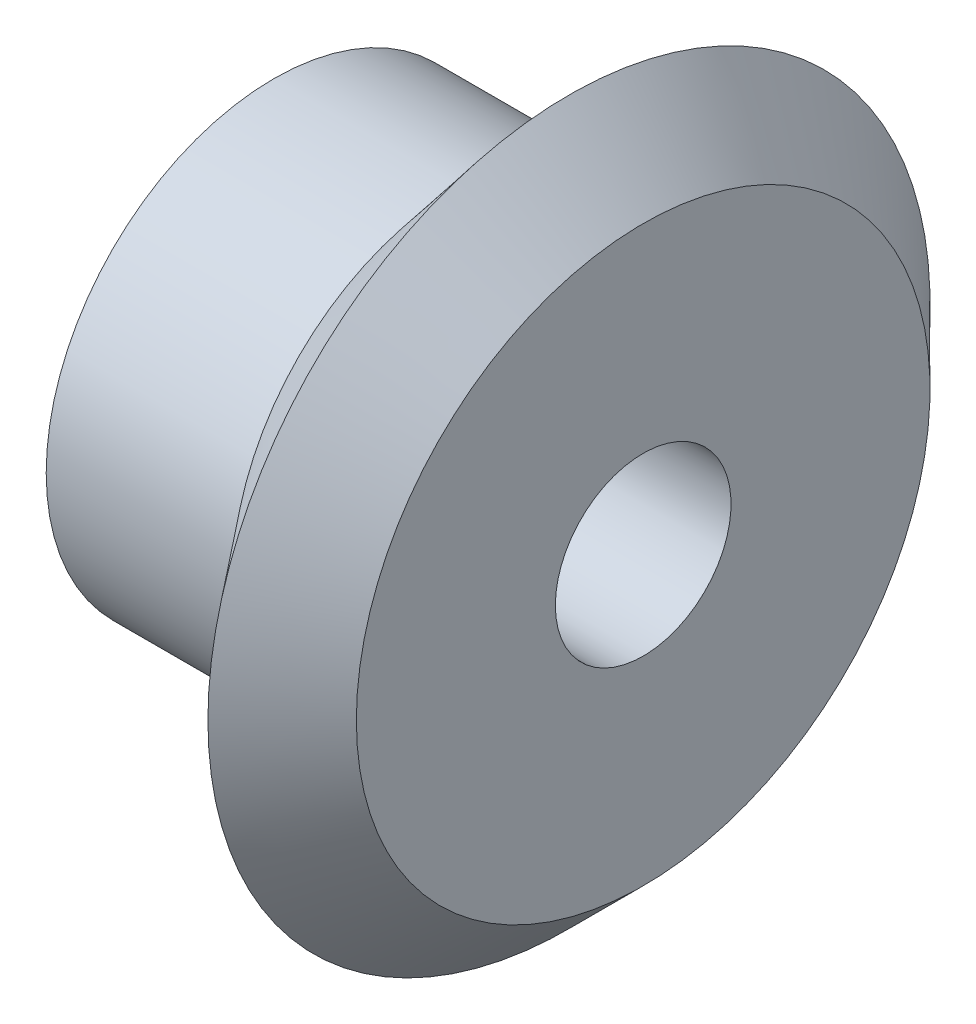
ISO-10303-21;
HEADER;
FILE_DESCRIPTION(('STEP AP214'),'2;1');
FILE_NAME('part.step','',(''),(''),'','','');
FILE_SCHEMA(('AUTOMOTIVE_DESIGN { 1 0 10303 214 1 1 1 1 }'));
ENDSEC;
DATA;
#1=APPLICATION_CONTEXT('core data for automotive mechanical design processes');
#2=APPLICATION_PROTOCOL_DEFINITION('international standard','automotive_design',2000,#1);
#3=PRODUCT_CONTEXT('',#1,'mechanical');
#4=PRODUCT('Part','Part','',(#3));
#5=PRODUCT_RELATED_PRODUCT_CATEGORY('part','',(#4));
#6=PRODUCT_DEFINITION_FORMATION('','',#4);
#7=PRODUCT_DEFINITION_CONTEXT('part definition',#1,'design');
#8=PRODUCT_DEFINITION('design','',#6,#7);
#9=PRODUCT_DEFINITION_SHAPE('','',#8);
#10=(LENGTH_UNIT() NAMED_UNIT(*) SI_UNIT(.MILLI.,.METRE.));
#11=(NAMED_UNIT(*) PLANE_ANGLE_UNIT() SI_UNIT($,.RADIAN.));
#12=(NAMED_UNIT(*) SI_UNIT($,.STERADIAN.) SOLID_ANGLE_UNIT());
#13=UNCERTAINTY_MEASURE_WITH_UNIT(LENGTH_MEASURE(1.E-05),#10,'distance_accuracy_value','');
#14=(GEOMETRIC_REPRESENTATION_CONTEXT(3) GLOBAL_UNCERTAINTY_ASSIGNED_CONTEXT((#13)) GLOBAL_UNIT_ASSIGNED_CONTEXT((#10,
#11,#12)) REPRESENTATION_CONTEXT('',''));
#15=CARTESIAN_POINT('',(0.,0.,0.));
#16=DIRECTION('',(0.,0.,1.));
#17=DIRECTION('',(1.,0.,0.));
#18=AXIS2_PLACEMENT_3D('',#15,#16,#17);
#19=CARTESIAN_POINT('',(4.84326150610929,2.45,0.));
#20=DIRECTION('',(-1.,0.,0.));
#21=DIRECTION('',(0.,0.,1.));
#22=AXIS2_PLACEMENT_3D('',#19,#20,#21);
#23=PLANE('',#22);
#24=CARTESIAN_POINT('',(4.84326150610929,0.,0.));
#25=DIRECTION('',(-1.,0.,0.));
#26=DIRECTION('',(0.,0.,1.));
#27=AXIS2_PLACEMENT_3D('',#24,#25,#26);
#28=CIRCLE('',#27,8.);
#29=CARTESIAN_POINT('',(4.84326150610929,0.,8.));
#30=VERTEX_POINT('',#29);
#31=EDGE_CURVE('E53',#30,#30,#28,.T.);
#32=ORIENTED_EDGE('',*,*,#31,.F.);
#33=EDGE_LOOP('',(#32));
#34=FACE_BOUND('',#33,.T.);
#35=CARTESIAN_POINT('',(4.84326150610929,0.,0.));
#36=DIRECTION('',(-1.,0.,0.));
#37=DIRECTION('',(0.,0.,1.));
#38=AXIS2_PLACEMENT_3D('',#35,#36,#37);
#39=CIRCLE('',#38,2.45);
#40=CARTESIAN_POINT('',(4.84326150610929,0.,2.45));
#41=VERTEX_POINT('',#40);
#42=EDGE_CURVE('E10',#41,#41,#39,.T.);
#43=ORIENTED_EDGE('',*,*,#42,.T.);
#44=EDGE_LOOP('',(#43));
#45=FACE_BOUND('',#44,.T.);
#46=ADVANCED_FACE('F31',(#34,#45),#23,.F.);
#47=CARTESIAN_POINT('',(-22.2616484326181,0.,0.));
#48=DIRECTION('',(-1.,0.,0.));
#49=DIRECTION('',(0.,0.,1.));
#50=AXIS2_PLACEMENT_3D('',#47,#48,#49);
#51=CYLINDRICAL_SURFACE('',#50,2.45);
#52=ORIENTED_EDGE('',*,*,#42,.F.);
#53=EDGE_LOOP('',(#52));
#54=FACE_BOUND('',#53,.T.);
#55=CARTESIAN_POINT('',(-5.45673849389071,0.,0.));
#56=DIRECTION('',(-1.,0.,0.));
#57=DIRECTION('',(0.,0.,1.));
#58=AXIS2_PLACEMENT_3D('',#55,#56,#57);
#59=CIRCLE('',#58,2.45);
#60=CARTESIAN_POINT('',(-5.45673849389071,0.,2.45));
#61=VERTEX_POINT('',#60);
#62=EDGE_CURVE('E37',#61,#61,#59,.T.);
#63=ORIENTED_EDGE('',*,*,#62,.T.);
#64=EDGE_LOOP('',(#63));
#65=FACE_BOUND('',#64,.T.);
#66=ADVANCED_FACE('F60',(#54,#65),#51,.F.);
#67=CARTESIAN_POINT('',(-5.45673849389071,2.45,0.));
#68=DIRECTION('',(1.,0.,0.));
#69=DIRECTION('',(0.,0.,-1.));
#70=AXIS2_PLACEMENT_3D('',#67,#68,#69);
#71=PLANE('',#70);
#72=ORIENTED_EDGE('',*,*,#62,.F.);
#73=EDGE_LOOP('',(#72));
#74=FACE_BOUND('',#73,.T.);
#75=CARTESIAN_POINT('',(-5.45673849389071,0.,0.));
#76=DIRECTION('',(-1.,0.,0.));
#77=DIRECTION('',(0.,0.,1.));
#78=AXIS2_PLACEMENT_3D('',#75,#76,#77);
#79=CIRCLE('',#78,6.35);
#80=CARTESIAN_POINT('',(-5.45673849389071,0.,6.35));
#81=VERTEX_POINT('',#80);
#82=EDGE_CURVE('E41',#81,#81,#79,.T.);
#83=ORIENTED_EDGE('',*,*,#82,.T.);
#84=EDGE_LOOP('',(#83));
#85=FACE_BOUND('',#84,.T.);
#86=ADVANCED_FACE('F64',(#74,#85),#71,.F.);
#87=CARTESIAN_POINT('',(-22.2616484326181,0.,0.));
#88=DIRECTION('',(-1.,0.,0.));
#89=DIRECTION('',(0.,0.,1.));
#90=AXIS2_PLACEMENT_3D('',#87,#88,#89);
#91=CYLINDRICAL_SURFACE('',#90,6.35);
#92=ORIENTED_EDGE('',*,*,#82,.F.);
#93=EDGE_LOOP('',(#92));
#94=FACE_BOUND('',#93,.T.);
#95=CARTESIAN_POINT('',(-0.266738493890709,0.,0.));
#96=DIRECTION('',(-1.,0.,0.));
#97=DIRECTION('',(0.,0.,1.));
#98=AXIS2_PLACEMENT_3D('',#95,#96,#97);
#99=CIRCLE('',#98,6.35);
#100=CARTESIAN_POINT('',(-0.266738493890709,0.,6.35));
#101=VERTEX_POINT('',#100);
#102=EDGE_CURVE('E45',#101,#101,#99,.T.);
#103=ORIENTED_EDGE('',*,*,#102,.T.);
#104=EDGE_LOOP('',(#103));
#105=FACE_BOUND('',#104,.T.);
#106=ADVANCED_FACE('F69',(#94,#105),#91,.T.);
#107=CARTESIAN_POINT('',(2.77326150610929,0.,0.));
#108=DIRECTION('',(1.,0.,0.));
#109=DIRECTION('',(0.,0.,-1.));
#110=AXIS2_PLACEMENT_3D('',#107,#108,#109);
#111=CONICAL_SURFACE('',#110,10.07,0.885652638903025);
#112=ORIENTED_EDGE('',*,*,#102,.F.);
#113=EDGE_LOOP('',(#112));
#114=FACE_BOUND('',#113,.T.);
#115=CARTESIAN_POINT('',(2.77326150610929,0.,0.));
#116=DIRECTION('',(-1.,0.,0.));
#117=DIRECTION('',(0.,0.,1.));
#118=AXIS2_PLACEMENT_3D('',#115,#116,#117);
#119=CIRCLE('',#118,10.07);
#120=CARTESIAN_POINT('',(2.77326150610929,0.,10.07));
#121=VERTEX_POINT('',#120);
#122=EDGE_CURVE('E50',#121,#121,#119,.T.);
#123=ORIENTED_EDGE('',*,*,#122,.T.);
#124=EDGE_LOOP('',(#123));
#125=FACE_BOUND('',#124,.T.);
#126=ADVANCED_FACE('F75',(#114,#125),#111,.T.);
#127=CARTESIAN_POINT('',(4.84326150610929,0.,0.));
#128=DIRECTION('',(-1.,0.,0.));
#129=DIRECTION('',(0.,0.,1.));
#130=AXIS2_PLACEMENT_3D('',#127,#128,#129);
#131=CONICAL_SURFACE('',#130,8.,0.785398163397447);
#132=ORIENTED_EDGE('',*,*,#122,.F.);
#133=EDGE_LOOP('',(#132));
#134=FACE_BOUND('',#133,.T.);
#135=ORIENTED_EDGE('',*,*,#31,.T.);
#136=EDGE_LOOP('',(#135));
#137=FACE_BOUND('',#136,.T.);
#138=ADVANCED_FACE('F57',(#134,#137),#131,.T.);
#139=CLOSED_SHELL('',(#46,#66,#86,#106,#126,#138));
#140=MANIFOLD_SOLID_BREP('B2',#139);
#141=ADVANCED_BREP_SHAPE_REPRESENTATION('',(#18,#140),#14);
#142=SHAPE_DEFINITION_REPRESENTATION(#9,#141);
ENDSEC;
END-ISO-10303-21;
